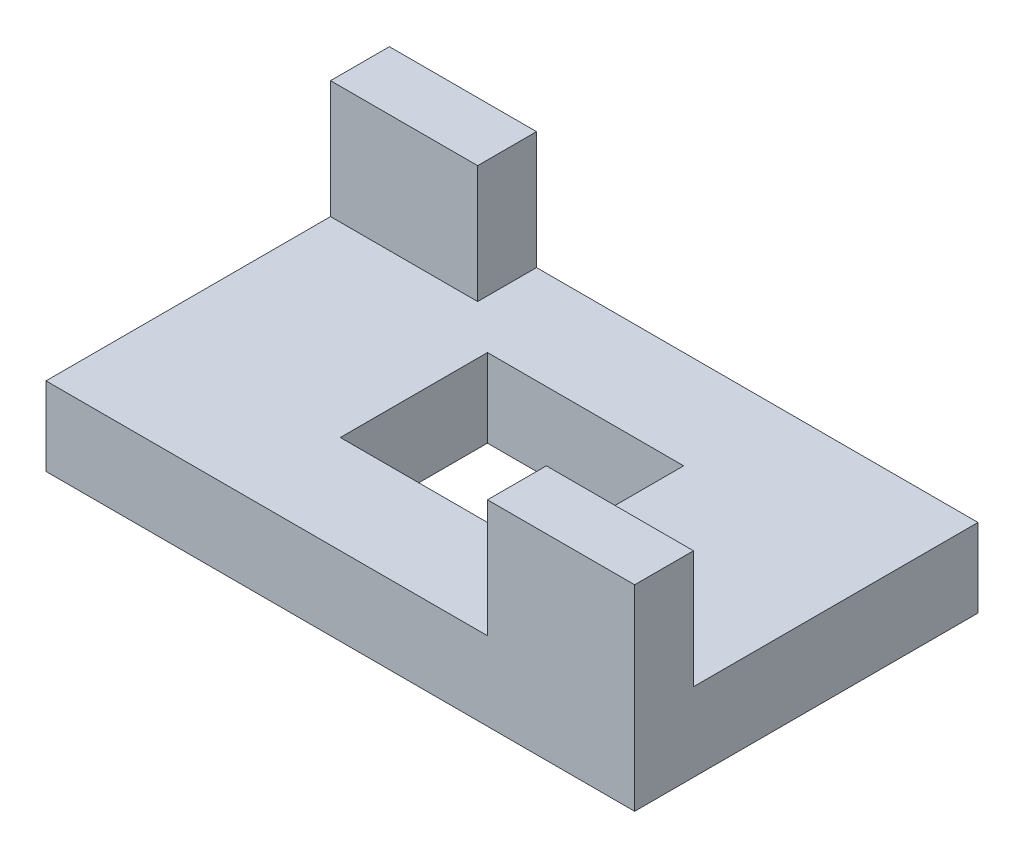
ISO-10303-21;
HEADER;
FILE_DESCRIPTION(('STEP AP214'),'2;1');
FILE_NAME('part.step','',(''),(''),'','','');
FILE_SCHEMA(('AUTOMOTIVE_DESIGN { 1 0 10303 214 1 1 1 1 }'));
ENDSEC;
DATA;
#1=APPLICATION_CONTEXT('core data for automotive mechanical design processes');
#2=APPLICATION_PROTOCOL_DEFINITION('international standard','automotive_design',2000,#1);
#3=PRODUCT_CONTEXT('',#1,'mechanical');
#4=PRODUCT('Part','Part','',(#3));
#5=PRODUCT_RELATED_PRODUCT_CATEGORY('part','',(#4));
#6=PRODUCT_DEFINITION_FORMATION('','',#4);
#7=PRODUCT_DEFINITION_CONTEXT('part definition',#1,'design');
#8=PRODUCT_DEFINITION('design','',#6,#7);
#9=PRODUCT_DEFINITION_SHAPE('','',#8);
#10=(LENGTH_UNIT() NAMED_UNIT(*) SI_UNIT(.MILLI.,.METRE.));
#11=(NAMED_UNIT(*) PLANE_ANGLE_UNIT() SI_UNIT($,.RADIAN.));
#12=(NAMED_UNIT(*) SI_UNIT($,.STERADIAN.) SOLID_ANGLE_UNIT());
#13=UNCERTAINTY_MEASURE_WITH_UNIT(LENGTH_MEASURE(1.E-05),#10,'distance_accuracy_value','');
#14=(GEOMETRIC_REPRESENTATION_CONTEXT(3) GLOBAL_UNCERTAINTY_ASSIGNED_CONTEXT((#13)) GLOBAL_UNIT_ASSIGNED_CONTEXT((#10,
#11,#12)) REPRESENTATION_CONTEXT('',''));
#15=CARTESIAN_POINT('',(0.,0.,0.));
#16=DIRECTION('',(0.,0.,1.));
#17=DIRECTION('',(1.,0.,0.));
#18=AXIS2_PLACEMENT_3D('',#15,#16,#17);
#19=CARTESIAN_POINT('',(0.,8.,0.));
#20=DIRECTION('',(0.,-1.,0.));
#21=DIRECTION('',(0.,0.,-1.));
#22=AXIS2_PLACEMENT_3D('',#19,#20,#21);
#23=PLANE('',#22);
#24=DIRECTION('',(1.,0.,0.));
#25=VECTOR('',#24,1.);
#26=CARTESIAN_POINT('',(0.,8.,-11.5));
#27=LINE('',#26,#25);
#28=CARTESIAN_POINT('',(-30.,8.,-11.5));
#29=VERTEX_POINT('',#28);
#30=CARTESIAN_POINT('',(-15.,8.,-11.5));
#31=VERTEX_POINT('',#30);
#32=EDGE_CURVE('E11',#29,#31,#27,.T.);
#33=ORIENTED_EDGE('',*,*,#32,.F.);
#34=DIRECTION('',(0.,0.,1.));
#35=VECTOR('',#34,1.);
#36=CARTESIAN_POINT('',(-30.,8.,-17.5));
#37=LINE('',#36,#35);
#38=CARTESIAN_POINT('',(-30.,8.,17.5));
#39=VERTEX_POINT('',#38);
#40=EDGE_CURVE('E256',#29,#39,#37,.T.);
#41=ORIENTED_EDGE('',*,*,#40,.T.);
#42=DIRECTION('',(1.,0.,0.));
#43=VECTOR('',#42,1.);
#44=CARTESIAN_POINT('',(-30.,8.,17.5));
#45=LINE('',#44,#43);
#46=CARTESIAN_POINT('',(15.,8.,17.5));
#47=VERTEX_POINT('',#46);
#48=EDGE_CURVE('E250',#39,#47,#45,.T.);
#49=ORIENTED_EDGE('',*,*,#48,.T.);
#50=DIRECTION('',(0.,0.,1.));
#51=VECTOR('',#50,1.);
#52=CARTESIAN_POINT('',(15.,8.,0.));
#53=LINE('',#52,#51);
#54=CARTESIAN_POINT('',(15.,8.,11.5));
#55=VERTEX_POINT('',#54);
#56=EDGE_CURVE('E290',#55,#47,#53,.T.);
#57=ORIENTED_EDGE('',*,*,#56,.F.);
#58=DIRECTION('',(-1.,0.,0.));
#59=VECTOR('',#58,1.);
#60=CARTESIAN_POINT('',(0.,8.,11.5));
#61=LINE('',#60,#59);
#62=CARTESIAN_POINT('',(30.,8.,11.5));
#63=VERTEX_POINT('',#62);
#64=EDGE_CURVE('E292',#63,#55,#61,.T.);
#65=ORIENTED_EDGE('',*,*,#64,.F.);
#66=DIRECTION('',(0.,0.,1.));
#67=VECTOR('',#66,1.);
#68=CARTESIAN_POINT('',(30.,8.,-17.5));
#69=LINE('',#68,#67);
#70=CARTESIAN_POINT('',(30.,8.,-17.5));
#71=VERTEX_POINT('',#70);
#72=EDGE_CURVE('E246',#71,#63,#69,.T.);
#73=ORIENTED_EDGE('',*,*,#72,.F.);
#74=DIRECTION('',(1.,0.,0.));
#75=VECTOR('',#74,1.);
#76=CARTESIAN_POINT('',(-30.,8.,-17.5));
#77=LINE('',#76,#75);
#78=CARTESIAN_POINT('',(-15.,8.,-17.5));
#79=VERTEX_POINT('',#78);
#80=EDGE_CURVE('E254',#79,#71,#77,.T.);
#81=ORIENTED_EDGE('',*,*,#80,.F.);
#82=DIRECTION('',(0.,0.,-1.));
#83=VECTOR('',#82,1.);
#84=CARTESIAN_POINT('',(-15.,8.,0.));
#85=LINE('',#84,#83);
#86=EDGE_CURVE('E53',#31,#79,#85,.T.);
#87=ORIENTED_EDGE('',*,*,#86,.F.);
#88=EDGE_LOOP('',(#33,#41,#49,#57,#65,#73,#81,#87));
#89=FACE_BOUND('',#88,.T.);
#90=DIRECTION('',(0.,0.,-1.));
#91=VECTOR('',#90,1.);
#92=CARTESIAN_POINT('',(10.,8.,0.));
#93=LINE('',#92,#91);
#94=CARTESIAN_POINT('',(10.,8.,7.5));
#95=VERTEX_POINT('',#94);
#96=CARTESIAN_POINT('',(10.,8.,-7.5));
#97=VERTEX_POINT('',#96);
#98=EDGE_CURVE('E147',#95,#97,#93,.T.);
#99=ORIENTED_EDGE('',*,*,#98,.F.);
#100=DIRECTION('',(1.,0.,0.));
#101=VECTOR('',#100,1.);
#102=CARTESIAN_POINT('',(0.,8.,7.5));
#103=LINE('',#102,#101);
#104=CARTESIAN_POINT('',(-10.,8.,7.5));
#105=VERTEX_POINT('',#104);
#106=EDGE_CURVE('E152',#105,#95,#103,.T.);
#107=ORIENTED_EDGE('',*,*,#106,.F.);
#108=DIRECTION('',(0.,0.,1.));
#109=VECTOR('',#108,1.);
#110=CARTESIAN_POINT('',(-10.,8.,0.));
#111=LINE('',#110,#109);
#112=CARTESIAN_POINT('',(-10.,8.,-7.5));
#113=VERTEX_POINT('',#112);
#114=EDGE_CURVE('E187',#113,#105,#111,.T.);
#115=ORIENTED_EDGE('',*,*,#114,.F.);
#116=DIRECTION('',(-1.,0.,0.));
#117=VECTOR('',#116,1.);
#118=CARTESIAN_POINT('',(0.,8.,-7.5));
#119=LINE('',#118,#117);
#120=EDGE_CURVE('E186',#97,#113,#119,.T.);
#121=ORIENTED_EDGE('',*,*,#120,.F.);
#122=EDGE_LOOP('',(#99,#107,#115,#121));
#123=FACE_BOUND('',#122,.T.);
#124=ADVANCED_FACE('F44',(#89,#123),#23,.F.);
#125=CARTESIAN_POINT('',(0.,0.,0.));
#126=DIRECTION('',(0.,-1.,0.));
#127=DIRECTION('',(0.,0.,-1.));
#128=AXIS2_PLACEMENT_3D('',#125,#126,#127);
#129=PLANE('',#128);
#130=DIRECTION('',(1.,0.,0.));
#131=VECTOR('',#130,1.);
#132=CARTESIAN_POINT('',(-30.,0.,-17.5));
#133=LINE('',#132,#131);
#134=CARTESIAN_POINT('',(-30.,0.,-17.5));
#135=VERTEX_POINT('',#134);
#136=CARTESIAN_POINT('',(30.,0.,-17.5));
#137=VERTEX_POINT('',#136);
#138=EDGE_CURVE('E268',#135,#137,#133,.T.);
#139=ORIENTED_EDGE('',*,*,#138,.T.);
#140=DIRECTION('',(0.,0.,1.));
#141=VECTOR('',#140,1.);
#142=CARTESIAN_POINT('',(30.,0.,-17.5));
#143=LINE('',#142,#141);
#144=CARTESIAN_POINT('',(30.,0.,17.5));
#145=VERTEX_POINT('',#144);
#146=EDGE_CURVE('E262',#137,#145,#143,.T.);
#147=ORIENTED_EDGE('',*,*,#146,.T.);
#148=DIRECTION('',(1.,0.,0.));
#149=VECTOR('',#148,1.);
#150=CARTESIAN_POINT('',(-30.,0.,17.5));
#151=LINE('',#150,#149);
#152=CARTESIAN_POINT('',(-30.,0.,17.5));
#153=VERTEX_POINT('',#152);
#154=EDGE_CURVE('E225',#153,#145,#151,.T.);
#155=ORIENTED_EDGE('',*,*,#154,.F.);
#156=DIRECTION('',(0.,0.,1.));
#157=VECTOR('',#156,1.);
#158=CARTESIAN_POINT('',(-30.,0.,-17.5));
#159=LINE('',#158,#157);
#160=EDGE_CURVE('E253',#135,#153,#159,.T.);
#161=ORIENTED_EDGE('',*,*,#160,.F.);
#162=EDGE_LOOP('',(#139,#147,#155,#161));
#163=FACE_BOUND('',#162,.T.);
#164=DIRECTION('',(1.,0.,0.));
#165=VECTOR('',#164,1.);
#166=CARTESIAN_POINT('',(-10.,0.,7.5));
#167=LINE('',#166,#165);
#168=CARTESIAN_POINT('',(-10.,0.,7.5));
#169=VERTEX_POINT('',#168);
#170=CARTESIAN_POINT('',(10.,0.,7.5));
#171=VERTEX_POINT('',#170);
#172=EDGE_CURVE('E166',#169,#171,#167,.T.);
#173=ORIENTED_EDGE('',*,*,#172,.T.);
#174=DIRECTION('',(0.,0.,-1.));
#175=VECTOR('',#174,1.);
#176=CARTESIAN_POINT('',(10.,0.,-7.5));
#177=LINE('',#176,#175);
#178=CARTESIAN_POINT('',(10.,0.,-7.5));
#179=VERTEX_POINT('',#178);
#180=EDGE_CURVE('E69',#171,#179,#177,.T.);
#181=ORIENTED_EDGE('',*,*,#180,.T.);
#182=DIRECTION('',(-1.,0.,0.));
#183=VECTOR('',#182,1.);
#184=CARTESIAN_POINT('',(-10.,0.,-7.5));
#185=LINE('',#184,#183);
#186=CARTESIAN_POINT('',(-10.,0.,-7.5));
#187=VERTEX_POINT('',#186);
#188=EDGE_CURVE('E158',#179,#187,#185,.T.);
#189=ORIENTED_EDGE('',*,*,#188,.T.);
#190=DIRECTION('',(0.,0.,1.));
#191=VECTOR('',#190,1.);
#192=CARTESIAN_POINT('',(-10.,0.,-7.5));
#193=LINE('',#192,#191);
#194=EDGE_CURVE('E164',#187,#169,#193,.T.);
#195=ORIENTED_EDGE('',*,*,#194,.T.);
#196=EDGE_LOOP('',(#173,#181,#189,#195));
#197=FACE_BOUND('',#196,.T.);
#198=ADVANCED_FACE('F169',(#163,#197),#129,.T.);
#199=CARTESIAN_POINT('',(-30.,8.,17.5));
#200=DIRECTION('',(0.,0.,-1.));
#201=DIRECTION('',(-1.,0.,0.));
#202=AXIS2_PLACEMENT_3D('',#199,#200,#201);
#203=PLANE('',#202);
#204=DIRECTION('',(0.,-1.,0.));
#205=VECTOR('',#204,1.);
#206=CARTESIAN_POINT('',(30.,8.,17.5));
#207=LINE('',#206,#205);
#208=CARTESIAN_POINT('',(30.,20.,17.5));
#209=VERTEX_POINT('',#208);
#210=EDGE_CURVE('E284',#209,#145,#207,.T.);
#211=ORIENTED_EDGE('',*,*,#210,.F.);
#212=DIRECTION('',(1.,0.,0.));
#213=VECTOR('',#212,1.);
#214=CARTESIAN_POINT('',(30.,20.,17.5));
#215=LINE('',#214,#213);
#216=CARTESIAN_POINT('',(15.,20.,17.5));
#217=VERTEX_POINT('',#216);
#218=EDGE_CURVE('E234',#217,#209,#215,.T.);
#219=ORIENTED_EDGE('',*,*,#218,.F.);
#220=DIRECTION('',(0.,-1.,0.));
#221=VECTOR('',#220,1.);
#222=CARTESIAN_POINT('',(15.,20.,17.5));
#223=LINE('',#222,#221);
#224=EDGE_CURVE('E228',#217,#47,#223,.T.);
#225=ORIENTED_EDGE('',*,*,#224,.T.);
#226=ORIENTED_EDGE('',*,*,#48,.F.);
#227=DIRECTION('',(0.,-1.,0.));
#228=VECTOR('',#227,1.);
#229=CARTESIAN_POINT('',(-30.,8.,17.5));
#230=LINE('',#229,#228);
#231=EDGE_CURVE('E261',#39,#153,#230,.T.);
#232=ORIENTED_EDGE('',*,*,#231,.T.);
#233=ORIENTED_EDGE('',*,*,#154,.T.);
#234=EDGE_LOOP('',(#211,#219,#225,#226,#232,#233));
#235=FACE_BOUND('',#234,.T.);
#236=ADVANCED_FACE('F50',(#235),#203,.F.);
#237=CARTESIAN_POINT('',(30.,8.,-17.5));
#238=DIRECTION('',(1.,0.,0.));
#239=DIRECTION('',(0.,0.,-1.));
#240=AXIS2_PLACEMENT_3D('',#237,#238,#239);
#241=PLANE('',#240);
#242=ORIENTED_EDGE('',*,*,#210,.T.);
#243=ORIENTED_EDGE('',*,*,#146,.F.);
#244=DIRECTION('',(0.,-1.,0.));
#245=VECTOR('',#244,1.);
#246=CARTESIAN_POINT('',(30.,8.,-17.5));
#247=LINE('',#246,#245);
#248=EDGE_CURVE('E276',#71,#137,#247,.T.);
#249=ORIENTED_EDGE('',*,*,#248,.F.);
#250=ORIENTED_EDGE('',*,*,#72,.T.);
#251=DIRECTION('',(0.,-1.,0.));
#252=VECTOR('',#251,1.);
#253=CARTESIAN_POINT('',(30.,20.,11.5));
#254=LINE('',#253,#252);
#255=CARTESIAN_POINT('',(30.,20.,11.5));
#256=VERTEX_POINT('',#255);
#257=EDGE_CURVE('E194',#256,#63,#254,.T.);
#258=ORIENTED_EDGE('',*,*,#257,.F.);
#259=DIRECTION('',(0.,0.,-1.));
#260=VECTOR('',#259,1.);
#261=CARTESIAN_POINT('',(30.,20.,17.5));
#262=LINE('',#261,#260);
#263=EDGE_CURVE('E199',#209,#256,#262,.T.);
#264=ORIENTED_EDGE('',*,*,#263,.F.);
#265=EDGE_LOOP('',(#242,#243,#249,#250,#258,#264));
#266=FACE_BOUND('',#265,.T.);
#267=ADVANCED_FACE('F331',(#266),#241,.T.);
#268=CARTESIAN_POINT('',(-30.,8.,-17.5));
#269=DIRECTION('',(0.,0.,-1.));
#270=DIRECTION('',(-1.,0.,0.));
#271=AXIS2_PLACEMENT_3D('',#268,#269,#270);
#272=PLANE('',#271);
#273=ORIENTED_EDGE('',*,*,#248,.T.);
#274=ORIENTED_EDGE('',*,*,#138,.F.);
#275=DIRECTION('',(0.,-1.,0.));
#276=VECTOR('',#275,1.);
#277=CARTESIAN_POINT('',(-30.,8.,-17.5));
#278=LINE('',#277,#276);
#279=CARTESIAN_POINT('',(-30.,20.,-17.5));
#280=VERTEX_POINT('',#279);
#281=EDGE_CURVE('E277',#280,#135,#278,.T.);
#282=ORIENTED_EDGE('',*,*,#281,.F.);
#283=DIRECTION('',(-1.,0.,0.));
#284=VECTOR('',#283,1.);
#285=CARTESIAN_POINT('',(-30.,20.,-17.5));
#286=LINE('',#285,#284);
#287=CARTESIAN_POINT('',(-15.,20.,-17.5));
#288=VERTEX_POINT('',#287);
#289=EDGE_CURVE('E206',#288,#280,#286,.T.);
#290=ORIENTED_EDGE('',*,*,#289,.F.);
#291=DIRECTION('',(0.,-1.,0.));
#292=VECTOR('',#291,1.);
#293=CARTESIAN_POINT('',(-15.,20.,-17.5));
#294=LINE('',#293,#292);
#295=EDGE_CURVE('E209',#288,#79,#294,.T.);
#296=ORIENTED_EDGE('',*,*,#295,.T.);
#297=ORIENTED_EDGE('',*,*,#80,.T.);
#298=EDGE_LOOP('',(#273,#274,#282,#290,#296,#297));
#299=FACE_BOUND('',#298,.T.);
#300=ADVANCED_FACE('F304',(#299),#272,.T.);
#301=CARTESIAN_POINT('',(-30.,8.,-17.5));
#302=DIRECTION('',(1.,0.,0.));
#303=DIRECTION('',(0.,0.,-1.));
#304=AXIS2_PLACEMENT_3D('',#301,#302,#303);
#305=PLANE('',#304);
#306=ORIENTED_EDGE('',*,*,#40,.F.);
#307=DIRECTION('',(0.,-1.,0.));
#308=VECTOR('',#307,1.);
#309=CARTESIAN_POINT('',(-30.,20.,-11.5));
#310=LINE('',#309,#308);
#311=CARTESIAN_POINT('',(-30.,20.,-11.5));
#312=VERTEX_POINT('',#311);
#313=EDGE_CURVE('E217',#312,#29,#310,.T.);
#314=ORIENTED_EDGE('',*,*,#313,.F.);
#315=DIRECTION('',(0.,0.,1.));
#316=VECTOR('',#315,1.);
#317=CARTESIAN_POINT('',(-30.,20.,-17.5));
#318=LINE('',#317,#316);
#319=EDGE_CURVE('E191',#280,#312,#318,.T.);
#320=ORIENTED_EDGE('',*,*,#319,.F.);
#321=ORIENTED_EDGE('',*,*,#281,.T.);
#322=ORIENTED_EDGE('',*,*,#160,.T.);
#323=ORIENTED_EDGE('',*,*,#231,.F.);
#324=EDGE_LOOP('',(#306,#314,#320,#321,#322,#323));
#325=FACE_BOUND('',#324,.T.);
#326=ADVANCED_FACE('F311',(#325),#305,.F.);
#327=CARTESIAN_POINT('',(30.,20.,11.5));
#328=DIRECTION('',(0.,0.,1.));
#329=DIRECTION('',(1.,0.,0.));
#330=AXIS2_PLACEMENT_3D('',#327,#328,#329);
#331=PLANE('',#330);
#332=ORIENTED_EDGE('',*,*,#257,.T.);
#333=ORIENTED_EDGE('',*,*,#64,.T.);
#334=DIRECTION('',(0.,-1.,0.));
#335=VECTOR('',#334,1.);
#336=CARTESIAN_POINT('',(15.,20.,11.5));
#337=LINE('',#336,#335);
#338=CARTESIAN_POINT('',(15.,20.,11.5));
#339=VERTEX_POINT('',#338);
#340=EDGE_CURVE('E227',#339,#55,#337,.T.);
#341=ORIENTED_EDGE('',*,*,#340,.F.);
#342=DIRECTION('',(-1.,0.,0.));
#343=VECTOR('',#342,1.);
#344=CARTESIAN_POINT('',(30.,20.,11.5));
#345=LINE('',#344,#343);
#346=EDGE_CURVE('E242',#256,#339,#345,.T.);
#347=ORIENTED_EDGE('',*,*,#346,.F.);
#348=EDGE_LOOP('',(#332,#333,#341,#347));
#349=FACE_BOUND('',#348,.T.);
#350=ADVANCED_FACE('F329',(#349),#331,.F.);
#351=CARTESIAN_POINT('',(15.,20.,17.5));
#352=DIRECTION('',(1.,0.,0.));
#353=DIRECTION('',(0.,0.,-1.));
#354=AXIS2_PLACEMENT_3D('',#351,#352,#353);
#355=PLANE('',#354);
#356=ORIENTED_EDGE('',*,*,#340,.T.);
#357=ORIENTED_EDGE('',*,*,#56,.T.);
#358=ORIENTED_EDGE('',*,*,#224,.F.);
#359=DIRECTION('',(0.,0.,1.));
#360=VECTOR('',#359,1.);
#361=CARTESIAN_POINT('',(15.,20.,17.5));
#362=LINE('',#361,#360);
#363=EDGE_CURVE('E236',#339,#217,#362,.T.);
#364=ORIENTED_EDGE('',*,*,#363,.F.);
#365=EDGE_LOOP('',(#356,#357,#358,#364));
#366=FACE_BOUND('',#365,.T.);
#367=ADVANCED_FACE('F326',(#366),#355,.F.);
#368=CARTESIAN_POINT('',(0.,20.,0.));
#369=DIRECTION('',(0.,1.,0.));
#370=DIRECTION('',(0.,0.,1.));
#371=AXIS2_PLACEMENT_3D('',#368,#369,#370);
#372=PLANE('',#371);
#373=ORIENTED_EDGE('',*,*,#263,.T.);
#374=ORIENTED_EDGE('',*,*,#346,.T.);
#375=ORIENTED_EDGE('',*,*,#363,.T.);
#376=ORIENTED_EDGE('',*,*,#218,.T.);
#377=EDGE_LOOP('',(#373,#374,#375,#376));
#378=FACE_BOUND('',#377,.T.);
#379=ADVANCED_FACE('F339',(#378),#372,.T.);
#380=CARTESIAN_POINT('',(-30.,20.,-11.5));
#381=DIRECTION('',(0.,0.,-1.));
#382=DIRECTION('',(-1.,0.,0.));
#383=AXIS2_PLACEMENT_3D('',#380,#381,#382);
#384=PLANE('',#383);
#385=ORIENTED_EDGE('',*,*,#313,.T.);
#386=ORIENTED_EDGE('',*,*,#32,.T.);
#387=DIRECTION('',(0.,-1.,0.));
#388=VECTOR('',#387,1.);
#389=CARTESIAN_POINT('',(-15.,20.,-11.5));
#390=LINE('',#389,#388);
#391=CARTESIAN_POINT('',(-15.,20.,-11.5));
#392=VERTEX_POINT('',#391);
#393=EDGE_CURVE('E212',#392,#31,#390,.T.);
#394=ORIENTED_EDGE('',*,*,#393,.F.);
#395=DIRECTION('',(1.,0.,0.));
#396=VECTOR('',#395,1.);
#397=CARTESIAN_POINT('',(-30.,20.,-11.5));
#398=LINE('',#397,#396);
#399=EDGE_CURVE('E200',#312,#392,#398,.T.);
#400=ORIENTED_EDGE('',*,*,#399,.F.);
#401=EDGE_LOOP('',(#385,#386,#394,#400));
#402=FACE_BOUND('',#401,.T.);
#403=ADVANCED_FACE('F320',(#402),#384,.F.);
#404=CARTESIAN_POINT('',(-15.,20.,-17.5));
#405=DIRECTION('',(-1.,0.,0.));
#406=DIRECTION('',(0.,0.,1.));
#407=AXIS2_PLACEMENT_3D('',#404,#405,#406);
#408=PLANE('',#407);
#409=ORIENTED_EDGE('',*,*,#393,.T.);
#410=ORIENTED_EDGE('',*,*,#86,.T.);
#411=ORIENTED_EDGE('',*,*,#295,.F.);
#412=DIRECTION('',(0.,0.,-1.));
#413=VECTOR('',#412,1.);
#414=CARTESIAN_POINT('',(-15.,20.,-17.5));
#415=LINE('',#414,#413);
#416=EDGE_CURVE('E201',#392,#288,#415,.T.);
#417=ORIENTED_EDGE('',*,*,#416,.F.);
#418=EDGE_LOOP('',(#409,#410,#411,#417));
#419=FACE_BOUND('',#418,.T.);
#420=ADVANCED_FACE('F299',(#419),#408,.F.);
#421=CARTESIAN_POINT('',(0.,20.,0.));
#422=DIRECTION('',(0.,1.,0.));
#423=DIRECTION('',(0.,0.,1.));
#424=AXIS2_PLACEMENT_3D('',#421,#422,#423);
#425=PLANE('',#424);
#426=ORIENTED_EDGE('',*,*,#319,.T.);
#427=ORIENTED_EDGE('',*,*,#399,.T.);
#428=ORIENTED_EDGE('',*,*,#416,.T.);
#429=ORIENTED_EDGE('',*,*,#289,.T.);
#430=EDGE_LOOP('',(#426,#427,#428,#429));
#431=FACE_BOUND('',#430,.T.);
#432=ADVANCED_FACE('F310',(#431),#425,.T.);
#433=CARTESIAN_POINT('',(10.,20.,-7.5));
#434=DIRECTION('',(-1.,0.,0.));
#435=DIRECTION('',(0.,0.,1.));
#436=AXIS2_PLACEMENT_3D('',#433,#434,#435);
#437=PLANE('',#436);
#438=ORIENTED_EDGE('',*,*,#98,.T.);
#439=DIRECTION('',(0.,-1.,0.));
#440=VECTOR('',#439,1.);
#441=CARTESIAN_POINT('',(10.,20.,-7.5));
#442=LINE('',#441,#440);
#443=EDGE_CURVE('E148',#97,#179,#442,.T.);
#444=ORIENTED_EDGE('',*,*,#443,.T.);
#445=ORIENTED_EDGE('',*,*,#180,.F.);
#446=DIRECTION('',(0.,-1.,0.));
#447=VECTOR('',#446,1.);
#448=CARTESIAN_POINT('',(10.,20.,7.5));
#449=LINE('',#448,#447);
#450=EDGE_CURVE('E180',#95,#171,#449,.T.);
#451=ORIENTED_EDGE('',*,*,#450,.F.);
#452=EDGE_LOOP('',(#438,#444,#445,#451));
#453=FACE_BOUND('',#452,.T.);
#454=ADVANCED_FACE('F146',(#453),#437,.T.);
#455=CARTESIAN_POINT('',(-10.,20.,-7.5));
#456=DIRECTION('',(0.,0.,1.));
#457=DIRECTION('',(1.,0.,0.));
#458=AXIS2_PLACEMENT_3D('',#455,#456,#457);
#459=PLANE('',#458);
#460=ORIENTED_EDGE('',*,*,#120,.T.);
#461=DIRECTION('',(0.,-1.,0.));
#462=VECTOR('',#461,1.);
#463=CARTESIAN_POINT('',(-10.,20.,-7.5));
#464=LINE('',#463,#462);
#465=EDGE_CURVE('E154',#113,#187,#464,.T.);
#466=ORIENTED_EDGE('',*,*,#465,.T.);
#467=ORIENTED_EDGE('',*,*,#188,.F.);
#468=ORIENTED_EDGE('',*,*,#443,.F.);
#469=EDGE_LOOP('',(#460,#466,#467,#468));
#470=FACE_BOUND('',#469,.T.);
#471=ADVANCED_FACE('F157',(#470),#459,.T.);
#472=CARTESIAN_POINT('',(-10.,20.,-7.5));
#473=DIRECTION('',(1.,0.,0.));
#474=DIRECTION('',(0.,0.,-1.));
#475=AXIS2_PLACEMENT_3D('',#472,#473,#474);
#476=PLANE('',#475);
#477=ORIENTED_EDGE('',*,*,#114,.T.);
#478=DIRECTION('',(0.,-1.,0.));
#479=VECTOR('',#478,1.);
#480=CARTESIAN_POINT('',(-10.,20.,7.5));
#481=LINE('',#480,#479);
#482=EDGE_CURVE('E62',#105,#169,#481,.T.);
#483=ORIENTED_EDGE('',*,*,#482,.T.);
#484=ORIENTED_EDGE('',*,*,#194,.F.);
#485=ORIENTED_EDGE('',*,*,#465,.F.);
#486=EDGE_LOOP('',(#477,#483,#484,#485));
#487=FACE_BOUND('',#486,.T.);
#488=ADVANCED_FACE('F454',(#487),#476,.T.);
#489=CARTESIAN_POINT('',(-10.,20.,7.5));
#490=DIRECTION('',(0.,0.,-1.));
#491=DIRECTION('',(-1.,0.,0.));
#492=AXIS2_PLACEMENT_3D('',#489,#490,#491);
#493=PLANE('',#492);
#494=ORIENTED_EDGE('',*,*,#106,.T.);
#495=ORIENTED_EDGE('',*,*,#450,.T.);
#496=ORIENTED_EDGE('',*,*,#172,.F.);
#497=ORIENTED_EDGE('',*,*,#482,.F.);
#498=EDGE_LOOP('',(#494,#495,#496,#497));
#499=FACE_BOUND('',#498,.T.);
#500=ADVANCED_FACE('F464',(#499),#493,.T.);
#501=CLOSED_SHELL('',(#124,#198,#236,#267,#300,#326,#350,#367,#379,#403,#420,#432,#454,#471,
#488,#500));
#502=MANIFOLD_SOLID_BREP('B2',#501);
#503=ADVANCED_BREP_SHAPE_REPRESENTATION('',(#18,#502),#14);
#504=SHAPE_DEFINITION_REPRESENTATION(#9,#503);
ENDSEC;
END-ISO-10303-21;
